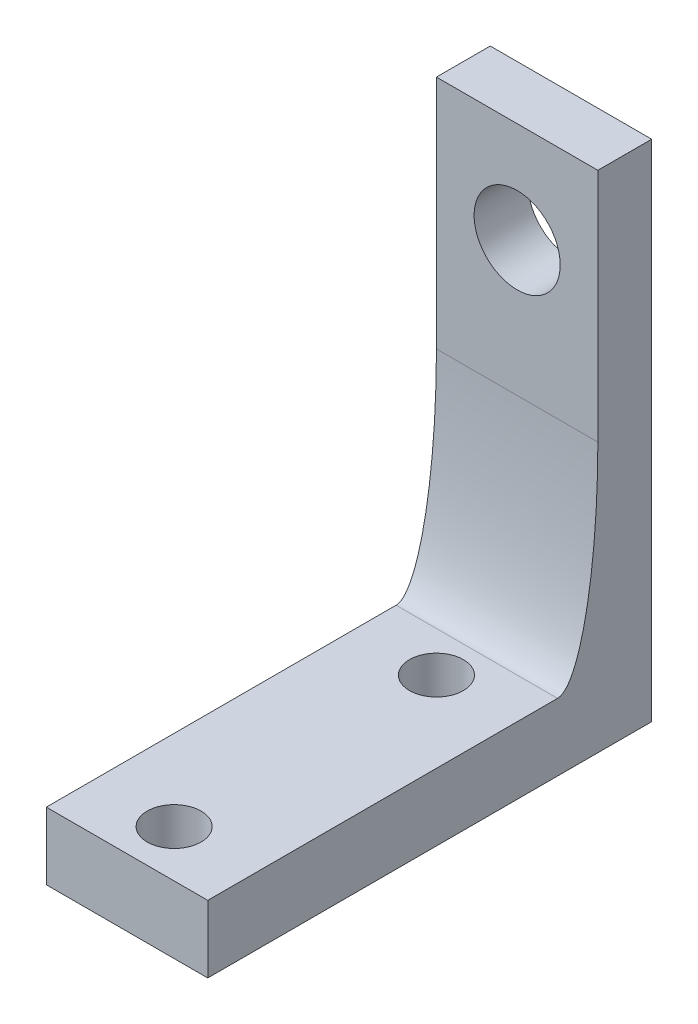
ISO-10303-21;
HEADER;
FILE_DESCRIPTION(('STEP AP214'),'2;1');
FILE_NAME('part.step','',(''),(''),'','','');
FILE_SCHEMA(('AUTOMOTIVE_DESIGN { 1 0 10303 214 1 1 1 1 }'));
ENDSEC;
DATA;
#1=APPLICATION_CONTEXT('core data for automotive mechanical design processes');
#2=APPLICATION_PROTOCOL_DEFINITION('international standard','automotive_design',2000,#1);
#3=PRODUCT_CONTEXT('',#1,'mechanical');
#4=PRODUCT('Part','Part','',(#3));
#5=PRODUCT_RELATED_PRODUCT_CATEGORY('part','',(#4));
#6=PRODUCT_DEFINITION_FORMATION('','',#4);
#7=PRODUCT_DEFINITION_CONTEXT('part definition',#1,'design');
#8=PRODUCT_DEFINITION('design','',#6,#7);
#9=PRODUCT_DEFINITION_SHAPE('','',#8);
#10=(LENGTH_UNIT() NAMED_UNIT(*) SI_UNIT(.MILLI.,.METRE.));
#11=(NAMED_UNIT(*) PLANE_ANGLE_UNIT() SI_UNIT($,.RADIAN.));
#12=(NAMED_UNIT(*) SI_UNIT($,.STERADIAN.) SOLID_ANGLE_UNIT());
#13=UNCERTAINTY_MEASURE_WITH_UNIT(LENGTH_MEASURE(1.E-05),#10,'distance_accuracy_value','');
#14=(GEOMETRIC_REPRESENTATION_CONTEXT(3) GLOBAL_UNCERTAINTY_ASSIGNED_CONTEXT((#13)) GLOBAL_UNIT_ASSIGNED_CONTEXT((#10,
#11,#12)) REPRESENTATION_CONTEXT('',''));
#15=CARTESIAN_POINT('',(0.,0.,0.));
#16=DIRECTION('',(0.,0.,1.));
#17=DIRECTION('',(1.,0.,0.));
#18=AXIS2_PLACEMENT_3D('',#15,#16,#17);
#19=CARTESIAN_POINT('',(0.,0.,4.));
#20=DIRECTION('',(0.,0.,-1.));
#21=DIRECTION('',(-1.,0.,0.));
#22=AXIS2_PLACEMENT_3D('',#19,#20,#21);
#23=PLANE('',#22);
#24=DIRECTION('',(0.,-1.,0.));
#25=VECTOR('',#24,1.);
#26=CARTESIAN_POINT('',(0.,0.,4.));
#27=LINE('',#26,#25);
#28=CARTESIAN_POINT('',(0.,32.5,4.));
#29=VERTEX_POINT('',#28);
#30=CARTESIAN_POINT('',(0.,15.,4.));
#31=VERTEX_POINT('',#30);
#32=EDGE_CURVE('E252',#29,#31,#27,.T.);
#33=ORIENTED_EDGE('',*,*,#32,.T.);
#34=CARTESIAN_POINT('',(12.6,15.,4.));
#35=CARTESIAN_POINT('',(8.2,15.,4.));
#36=CARTESIAN_POINT('',(3.8,15.,4.));
#37=CARTESIAN_POINT('',(-0.600000000000003,15.,4.));
#38=(BOUNDED_CURVE() B_SPLINE_CURVE(3,(#34,#35,#36,#37),.UNSPECIFIED.,.F.,
.F.) B_SPLINE_CURVE_WITH_KNOTS((4,4),(-0.000600000000000003,0.0126),
.UNSPECIFIED.) CURVE() GEOMETRIC_REPRESENTATION_ITEM() RATIONAL_B_SPLINE_CURVE((1.,1.,1.,1.)) REPRESENTATION_ITEM(''));
#39=CARTESIAN_POINT('',(12.,15.,4.));
#40=VERTEX_POINT('',#39);
#41=EDGE_CURVE('E226',#31,#40,#38,.F.);
#42=ORIENTED_EDGE('',*,*,#41,.T.);
#43=DIRECTION('',(0.,1.,0.));
#44=VECTOR('',#43,1.);
#45=CARTESIAN_POINT('',(12.,0.,4.));
#46=LINE('',#45,#44);
#47=CARTESIAN_POINT('',(12.,32.5,4.));
#48=VERTEX_POINT('',#47);
#49=EDGE_CURVE('E255',#40,#48,#46,.T.);
#50=ORIENTED_EDGE('',*,*,#49,.T.);
#51=DIRECTION('',(-1.,0.,0.));
#52=VECTOR('',#51,1.);
#53=CARTESIAN_POINT('',(0.,32.5,4.));
#54=LINE('',#53,#52);
#55=EDGE_CURVE('E248',#48,#29,#54,.T.);
#56=ORIENTED_EDGE('',*,*,#55,.T.);
#57=EDGE_LOOP('',(#33,#42,#50,#56));
#58=FACE_BOUND('',#57,.T.);
#59=CARTESIAN_POINT('',(6.,25.,4.));
#60=DIRECTION('',(0.,0.,1.));
#61=DIRECTION('',(1.,0.,0.));
#62=AXIS2_PLACEMENT_3D('',#59,#60,#61);
#63=CIRCLE('',#62,3.2);
#64=CARTESIAN_POINT('',(9.2,25.,4.));
#65=VERTEX_POINT('',#64);
#66=EDGE_CURVE('E117',#65,#65,#63,.T.);
#67=ORIENTED_EDGE('',*,*,#66,.F.);
#68=EDGE_LOOP('',(#67));
#69=FACE_BOUND('',#68,.T.);
#70=ADVANCED_FACE('F38',(#58,#69),#23,.F.);
#71=CARTESIAN_POINT('',(0.,0.,0.));
#72=DIRECTION('',(0.,0.,-1.));
#73=DIRECTION('',(-1.,0.,0.));
#74=AXIS2_PLACEMENT_3D('',#71,#72,#73);
#75=PLANE('',#74);
#76=DIRECTION('',(0.,-1.,0.));
#77=VECTOR('',#76,1.);
#78=CARTESIAN_POINT('',(0.,0.,0.));
#79=LINE('',#78,#77);
#80=CARTESIAN_POINT('',(0.,32.5,0.));
#81=VERTEX_POINT('',#80);
#82=CARTESIAN_POINT('',(0.,-5.,0.));
#83=VERTEX_POINT('',#82);
#84=EDGE_CURVE('E105',#81,#83,#79,.T.);
#85=ORIENTED_EDGE('',*,*,#84,.F.);
#86=DIRECTION('',(-1.,0.,0.));
#87=VECTOR('',#86,1.);
#88=CARTESIAN_POINT('',(0.,32.5,0.));
#89=LINE('',#88,#87);
#90=CARTESIAN_POINT('',(12.,32.5,0.));
#91=VERTEX_POINT('',#90);
#92=EDGE_CURVE('E256',#91,#81,#89,.T.);
#93=ORIENTED_EDGE('',*,*,#92,.F.);
#94=DIRECTION('',(0.,1.,0.));
#95=VECTOR('',#94,1.);
#96=CARTESIAN_POINT('',(12.,0.,0.));
#97=LINE('',#96,#95);
#98=CARTESIAN_POINT('',(12.,-5.,0.));
#99=VERTEX_POINT('',#98);
#100=EDGE_CURVE('E116',#99,#91,#97,.T.);
#101=ORIENTED_EDGE('',*,*,#100,.F.);
#102=DIRECTION('',(1.,0.,0.));
#103=VECTOR('',#102,1.);
#104=CARTESIAN_POINT('',(0.,-5.,0.));
#105=LINE('',#104,#103);
#106=EDGE_CURVE('E120',#83,#99,#105,.T.);
#107=ORIENTED_EDGE('',*,*,#106,.F.);
#108=EDGE_LOOP('',(#85,#93,#101,#107));
#109=FACE_BOUND('',#108,.T.);
#110=CARTESIAN_POINT('',(6.,25.,0.));
#111=DIRECTION('',(0.,0.,1.));
#112=DIRECTION('',(1.,0.,0.));
#113=AXIS2_PLACEMENT_3D('',#110,#111,#112);
#114=CIRCLE('',#113,3.2);
#115=CARTESIAN_POINT('',(9.2,25.,0.));
#116=VERTEX_POINT('',#115);
#117=EDGE_CURVE('E260',#116,#116,#114,.T.);
#118=ORIENTED_EDGE('',*,*,#117,.T.);
#119=EDGE_LOOP('',(#118));
#120=FACE_BOUND('',#119,.T.);
#121=ADVANCED_FACE('F121',(#109,#120),#75,.T.);
#122=CARTESIAN_POINT('',(0.,0.,4.));
#123=DIRECTION('',(1.,0.,0.));
#124=DIRECTION('',(0.,1.,0.));
#125=AXIS2_PLACEMENT_3D('',#122,#123,#124);
#126=PLANE('',#125);
#127=ORIENTED_EDGE('',*,*,#84,.T.);
#128=DIRECTION('',(0.,0.,-1.));
#129=VECTOR('',#128,1.);
#130=CARTESIAN_POINT('',(0.,-5.,0.));
#131=LINE('',#130,#129);
#132=CARTESIAN_POINT('',(0.,-5.,33.));
#133=VERTEX_POINT('',#132);
#134=EDGE_CURVE('E110',#133,#83,#131,.T.);
#135=ORIENTED_EDGE('',*,*,#134,.F.);
#136=DIRECTION('',(0.,1.,0.));
#137=VECTOR('',#136,1.);
#138=CARTESIAN_POINT('',(0.,-5.,33.));
#139=LINE('',#138,#137);
#140=CARTESIAN_POINT('',(0.,0.,33.));
#141=VERTEX_POINT('',#140);
#142=EDGE_CURVE('E142',#133,#141,#139,.T.);
#143=ORIENTED_EDGE('',*,*,#142,.T.);
#144=DIRECTION('',(0.,0.,-1.));
#145=VECTOR('',#144,1.);
#146=CARTESIAN_POINT('',(0.,0.,0.));
#147=LINE('',#146,#145);
#148=CARTESIAN_POINT('',(0.,0.,7.));
#149=VERTEX_POINT('',#148);
#150=EDGE_CURVE('E147',#141,#149,#147,.T.);
#151=ORIENTED_EDGE('',*,*,#150,.T.);
#152=CARTESIAN_POINT('',(0.,15.,4.));
#153=CARTESIAN_POINT('',(0.,0.,4.));
#154=CARTESIAN_POINT('',(0.,0.,7.));
#155=(BOUNDED_CURVE() B_SPLINE_CURVE(2,(#152,#153,#154),.UNSPECIFIED.,.F.,
.F.) B_SPLINE_CURVE_WITH_KNOTS((3,3),(0.,1.),
.UNSPECIFIED.) CURVE() GEOMETRIC_REPRESENTATION_ITEM() RATIONAL_B_SPLINE_CURVE((1.,
0.707106781186547,1.)) REPRESENTATION_ITEM(''));
#156=EDGE_CURVE('E12',#149,#31,#155,.F.);
#157=ORIENTED_EDGE('',*,*,#156,.T.);
#158=ORIENTED_EDGE('',*,*,#32,.F.);
#159=DIRECTION('',(0.,0.,-1.));
#160=VECTOR('',#159,1.);
#161=CARTESIAN_POINT('',(0.,32.5,4.));
#162=LINE('',#161,#160);
#163=EDGE_CURVE('E113',#29,#81,#162,.T.);
#164=ORIENTED_EDGE('',*,*,#163,.T.);
#165=EDGE_LOOP('',(#127,#135,#143,#151,#157,#158,#164));
#166=FACE_BOUND('',#165,.T.);
#167=ADVANCED_FACE('F107',(#166),#126,.F.);
#168=CARTESIAN_POINT('',(12.,0.,4.));
#169=DIRECTION('',(-1.,0.,0.));
#170=DIRECTION('',(0.,-1.,0.));
#171=AXIS2_PLACEMENT_3D('',#168,#169,#170);
#172=PLANE('',#171);
#173=ORIENTED_EDGE('',*,*,#100,.T.);
#174=DIRECTION('',(0.,0.,-1.));
#175=VECTOR('',#174,1.);
#176=CARTESIAN_POINT('',(12.,32.5,4.));
#177=LINE('',#176,#175);
#178=EDGE_CURVE('E243',#48,#91,#177,.T.);
#179=ORIENTED_EDGE('',*,*,#178,.F.);
#180=ORIENTED_EDGE('',*,*,#49,.F.);
#181=CARTESIAN_POINT('',(12.,0.,7.));
#182=CARTESIAN_POINT('',(12.,0.,4.));
#183=CARTESIAN_POINT('',(12.,15.,4.));
#184=(BOUNDED_CURVE() B_SPLINE_CURVE(2,(#181,#182,#183),.UNSPECIFIED.,.F.,
.F.) B_SPLINE_CURVE_WITH_KNOTS((3,3),(0.,1.),
.UNSPECIFIED.) CURVE() GEOMETRIC_REPRESENTATION_ITEM() RATIONAL_B_SPLINE_CURVE((1.,
0.707106781186548,1.)) REPRESENTATION_ITEM(''));
#185=CARTESIAN_POINT('',(12.,0.,7.));
#186=VERTEX_POINT('',#185);
#187=EDGE_CURVE('E52',#40,#186,#184,.F.);
#188=ORIENTED_EDGE('',*,*,#187,.T.);
#189=DIRECTION('',(0.,0.,1.));
#190=VECTOR('',#189,1.);
#191=CARTESIAN_POINT('',(12.,0.,0.));
#192=LINE('',#191,#190);
#193=CARTESIAN_POINT('',(12.,0.,33.));
#194=VERTEX_POINT('',#193);
#195=EDGE_CURVE('E134',#186,#194,#192,.T.);
#196=ORIENTED_EDGE('',*,*,#195,.T.);
#197=DIRECTION('',(0.,1.,0.));
#198=VECTOR('',#197,1.);
#199=CARTESIAN_POINT('',(12.,-5.,33.));
#200=LINE('',#199,#198);
#201=CARTESIAN_POINT('',(12.,-5.,33.));
#202=VERTEX_POINT('',#201);
#203=EDGE_CURVE('E268',#202,#194,#200,.T.);
#204=ORIENTED_EDGE('',*,*,#203,.F.);
#205=DIRECTION('',(0.,0.,1.));
#206=VECTOR('',#205,1.);
#207=CARTESIAN_POINT('',(12.,-5.,0.));
#208=LINE('',#207,#206);
#209=EDGE_CURVE('E125',#99,#202,#208,.T.);
#210=ORIENTED_EDGE('',*,*,#209,.F.);
#211=EDGE_LOOP('',(#173,#179,#180,#188,#196,#204,#210));
#212=FACE_BOUND('',#211,.T.);
#213=ADVANCED_FACE('F189',(#212),#172,.F.);
#214=CARTESIAN_POINT('',(0.,32.5,4.));
#215=DIRECTION('',(0.,-1.,0.));
#216=DIRECTION('',(0.,0.,-1.));
#217=AXIS2_PLACEMENT_3D('',#214,#215,#216);
#218=PLANE('',#217);
#219=ORIENTED_EDGE('',*,*,#92,.T.);
#220=ORIENTED_EDGE('',*,*,#163,.F.);
#221=ORIENTED_EDGE('',*,*,#55,.F.);
#222=ORIENTED_EDGE('',*,*,#178,.T.);
#223=EDGE_LOOP('',(#219,#220,#221,#222));
#224=FACE_BOUND('',#223,.T.);
#225=ADVANCED_FACE('F179',(#224),#218,.F.);
#226=CARTESIAN_POINT('',(6.,25.,4.));
#227=DIRECTION('',(0.,0.,-1.));
#228=DIRECTION('',(-1.,0.,0.));
#229=AXIS2_PLACEMENT_3D('',#226,#227,#228);
#230=CYLINDRICAL_SURFACE('',#229,3.2);
#231=ORIENTED_EDGE('',*,*,#66,.T.);
#232=EDGE_LOOP('',(#231));
#233=FACE_BOUND('',#232,.T.);
#234=ORIENTED_EDGE('',*,*,#117,.F.);
#235=EDGE_LOOP('',(#234));
#236=FACE_BOUND('',#235,.T.);
#237=ADVANCED_FACE('F170',(#233,#236),#230,.F.);
#238=CARTESIAN_POINT('',(0.,0.,0.));
#239=DIRECTION('',(0.,1.,0.));
#240=DIRECTION('',(0.,0.,1.));
#241=AXIS2_PLACEMENT_3D('',#238,#239,#240);
#242=PLANE('',#241);
#243=CARTESIAN_POINT('',(6.,0.,29.5));
#244=DIRECTION('',(0.,-1.,0.));
#245=DIRECTION('',(0.,0.,-1.));
#246=AXIS2_PLACEMENT_3D('',#243,#244,#245);
#247=CIRCLE('',#246,2.);
#248=CARTESIAN_POINT('',(6.,0.,27.5));
#249=VERTEX_POINT('',#248);
#250=EDGE_CURVE('E294',#249,#249,#247,.T.);
#251=ORIENTED_EDGE('',*,*,#250,.T.);
#252=EDGE_LOOP('',(#251));
#253=FACE_BOUND('',#252,.T.);
#254=CARTESIAN_POINT('',(6.,0.,10.));
#255=DIRECTION('',(0.,-1.,0.));
#256=DIRECTION('',(0.,0.,-1.));
#257=AXIS2_PLACEMENT_3D('',#254,#255,#256);
#258=CIRCLE('',#257,2.);
#259=CARTESIAN_POINT('',(6.,0.,8.));
#260=VERTEX_POINT('',#259);
#261=EDGE_CURVE('E137',#260,#260,#258,.T.);
#262=ORIENTED_EDGE('',*,*,#261,.T.);
#263=EDGE_LOOP('',(#262));
#264=FACE_BOUND('',#263,.T.);
#265=ORIENTED_EDGE('',*,*,#195,.F.);
#266=CARTESIAN_POINT('',(-0.600000000000003,0.,7.));
#267=CARTESIAN_POINT('',(3.8,0.,7.));
#268=CARTESIAN_POINT('',(8.2,0.,7.));
#269=CARTESIAN_POINT('',(12.6,0.,7.));
#270=(BOUNDED_CURVE() B_SPLINE_CURVE(3,(#266,#267,#268,#269),.UNSPECIFIED.,.F.,
.F.) B_SPLINE_CURVE_WITH_KNOTS((4,4),(-0.000600000000000003,0.0126),
.UNSPECIFIED.) CURVE() GEOMETRIC_REPRESENTATION_ITEM() RATIONAL_B_SPLINE_CURVE((1.,1.,1.,1.)) REPRESENTATION_ITEM(''));
#271=EDGE_CURVE('E66',#186,#149,#270,.F.);
#272=ORIENTED_EDGE('',*,*,#271,.T.);
#273=ORIENTED_EDGE('',*,*,#150,.F.);
#274=DIRECTION('',(-1.,0.,0.));
#275=VECTOR('',#274,1.);
#276=CARTESIAN_POINT('',(0.,0.,33.));
#277=LINE('',#276,#275);
#278=EDGE_CURVE('E132',#194,#141,#277,.T.);
#279=ORIENTED_EDGE('',*,*,#278,.F.);
#280=EDGE_LOOP('',(#265,#272,#273,#279));
#281=FACE_BOUND('',#280,.T.);
#282=ADVANCED_FACE('F160',(#253,#264,#281),#242,.T.);
#283=CARTESIAN_POINT('',(0.,-5.,0.));
#284=DIRECTION('',(0.,1.,0.));
#285=DIRECTION('',(0.,0.,1.));
#286=AXIS2_PLACEMENT_3D('',#283,#284,#285);
#287=PLANE('',#286);
#288=ORIENTED_EDGE('',*,*,#134,.T.);
#289=ORIENTED_EDGE('',*,*,#106,.T.);
#290=ORIENTED_EDGE('',*,*,#209,.T.);
#291=DIRECTION('',(-1.,0.,0.));
#292=VECTOR('',#291,1.);
#293=CARTESIAN_POINT('',(0.,-5.,33.));
#294=LINE('',#293,#292);
#295=EDGE_CURVE('E130',#202,#133,#294,.T.);
#296=ORIENTED_EDGE('',*,*,#295,.T.);
#297=EDGE_LOOP('',(#288,#289,#290,#296));
#298=FACE_BOUND('',#297,.T.);
#299=CARTESIAN_POINT('',(6.,-5.,10.));
#300=DIRECTION('',(0.,-1.,0.));
#301=DIRECTION('',(0.,0.,-1.));
#302=AXIS2_PLACEMENT_3D('',#299,#300,#301);
#303=CIRCLE('',#302,2.);
#304=CARTESIAN_POINT('',(6.,-5.,8.));
#305=VERTEX_POINT('',#304);
#306=EDGE_CURVE('E150',#305,#305,#303,.T.);
#307=ORIENTED_EDGE('',*,*,#306,.F.);
#308=EDGE_LOOP('',(#307));
#309=FACE_BOUND('',#308,.T.);
#310=CARTESIAN_POINT('',(6.,-5.,29.5));
#311=DIRECTION('',(0.,-1.,0.));
#312=DIRECTION('',(0.,0.,-1.));
#313=AXIS2_PLACEMENT_3D('',#310,#311,#312);
#314=CIRCLE('',#313,2.);
#315=CARTESIAN_POINT('',(6.,-5.,27.5));
#316=VERTEX_POINT('',#315);
#317=EDGE_CURVE('E291',#316,#316,#314,.T.);
#318=ORIENTED_EDGE('',*,*,#317,.F.);
#319=EDGE_LOOP('',(#318));
#320=FACE_BOUND('',#319,.T.);
#321=ADVANCED_FACE('F127',(#298,#309,#320),#287,.F.);
#322=CARTESIAN_POINT('',(0.,-5.,33.));
#323=DIRECTION('',(0.,0.,-1.));
#324=DIRECTION('',(-1.,0.,0.));
#325=AXIS2_PLACEMENT_3D('',#322,#323,#324);
#326=PLANE('',#325);
#327=ORIENTED_EDGE('',*,*,#278,.T.);
#328=ORIENTED_EDGE('',*,*,#142,.F.);
#329=ORIENTED_EDGE('',*,*,#295,.F.);
#330=ORIENTED_EDGE('',*,*,#203,.T.);
#331=EDGE_LOOP('',(#327,#328,#329,#330));
#332=FACE_BOUND('',#331,.T.);
#333=ADVANCED_FACE('F173',(#332),#326,.F.);
#334=CARTESIAN_POINT('',(6.,-5.,10.));
#335=DIRECTION('',(0.,1.,0.));
#336=DIRECTION('',(0.,0.,1.));
#337=AXIS2_PLACEMENT_3D('',#334,#335,#336);
#338=CYLINDRICAL_SURFACE('',#337,2.);
#339=ORIENTED_EDGE('',*,*,#306,.T.);
#340=EDGE_LOOP('',(#339));
#341=FACE_BOUND('',#340,.T.);
#342=ORIENTED_EDGE('',*,*,#261,.F.);
#343=EDGE_LOOP('',(#342));
#344=FACE_BOUND('',#343,.T.);
#345=ADVANCED_FACE('F176',(#341,#344),#338,.F.);
#346=CARTESIAN_POINT('',(6.,-5.,29.5));
#347=DIRECTION('',(0.,1.,0.));
#348=DIRECTION('',(0.,0.,1.));
#349=AXIS2_PLACEMENT_3D('',#346,#347,#348);
#350=CYLINDRICAL_SURFACE('',#349,2.);
#351=ORIENTED_EDGE('',*,*,#317,.T.);
#352=EDGE_LOOP('',(#351));
#353=FACE_BOUND('',#352,.T.);
#354=ORIENTED_EDGE('',*,*,#250,.F.);
#355=EDGE_LOOP('',(#354));
#356=FACE_BOUND('',#355,.T.);
#357=ADVANCED_FACE('F278',(#353,#356),#350,.F.);
#358=CARTESIAN_POINT('',(-0.600000000000003,15.,4.));
#359=CARTESIAN_POINT('',(3.8,15.,4.));
#360=CARTESIAN_POINT('',(8.2,15.,4.));
#361=CARTESIAN_POINT('',(12.6,15.,4.));
#362=CARTESIAN_POINT('',(-0.600000000000003,0.,4.));
#363=CARTESIAN_POINT('',(3.8,0.,4.));
#364=CARTESIAN_POINT('',(8.2,0.,4.));
#365=CARTESIAN_POINT('',(12.6,0.,4.));
#366=CARTESIAN_POINT('',(-0.600000000000003,0.,7.));
#367=CARTESIAN_POINT('',(3.8,0.,7.));
#368=CARTESIAN_POINT('',(8.2,0.,7.));
#369=CARTESIAN_POINT('',(12.6,0.,7.));
#370=(BOUNDED_SURFACE() B_SPLINE_SURFACE(2,3,((#358,#359,#360,#361),(#362,#363,#364,#365),(#366,
#367,#368,#369)),.UNSPECIFIED.,.F.,.F.,.F.) B_SPLINE_SURFACE_WITH_KNOTS((3,3),(4,4),(0.,1.),
(-0.000600000000000003,0.0126),
.UNSPECIFIED.) GEOMETRIC_REPRESENTATION_ITEM() RATIONAL_B_SPLINE_SURFACE(((1.,1.,1.,1.),
(0.707106781186548,0.707106781186548,0.707106781186548,0.707106781186548),(1.,1.,1.,1.))) REPRESENTATION_ITEM('') SURFACE());
#371=ORIENTED_EDGE('',*,*,#156,.F.);
#372=ORIENTED_EDGE('',*,*,#271,.F.);
#373=ORIENTED_EDGE('',*,*,#187,.F.);
#374=ORIENTED_EDGE('',*,*,#41,.F.);
#375=EDGE_LOOP('',(#371,#372,#373,#374));
#376=FACE_BOUND('',#375,.T.);
#377=ADVANCED_FACE('F41',(#376),#370,.T.);
#378=CLOSED_SHELL('',(#70,#121,#167,#213,#225,#237,#282,#321,#333,#345,#357,#377));
#379=MANIFOLD_SOLID_BREP('B2',#378);
#380=ADVANCED_BREP_SHAPE_REPRESENTATION('',(#18,#379),#14);
#381=SHAPE_DEFINITION_REPRESENTATION(#9,#380);
ENDSEC;
END-ISO-10303-21;
